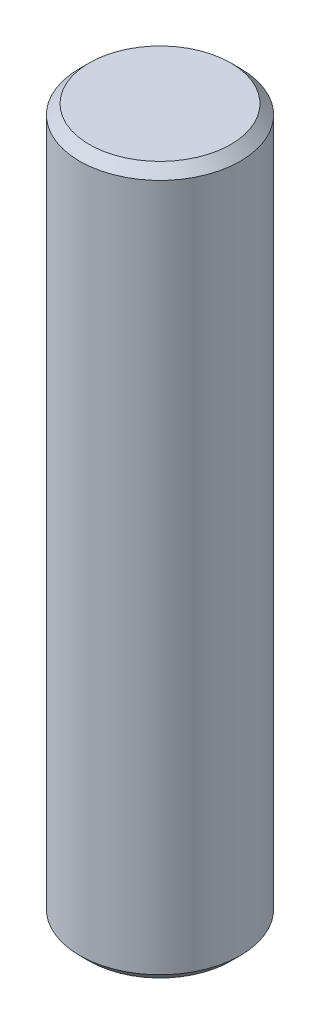
ISO-10303-21;
HEADER;
FILE_DESCRIPTION(('STEP AP214'),'2;1');
FILE_NAME('part.step','',(''),(''),'','','');
FILE_SCHEMA(('AUTOMOTIVE_DESIGN { 1 0 10303 214 1 1 1 1 }'));
ENDSEC;
DATA;
#1=APPLICATION_CONTEXT('core data for automotive mechanical design processes');
#2=APPLICATION_PROTOCOL_DEFINITION('international standard','automotive_design',2000,#1);
#3=PRODUCT_CONTEXT('',#1,'mechanical');
#4=PRODUCT('Part','Part','',(#3));
#5=PRODUCT_RELATED_PRODUCT_CATEGORY('part','',(#4));
#6=PRODUCT_DEFINITION_FORMATION('','',#4);
#7=PRODUCT_DEFINITION_CONTEXT('part definition',#1,'design');
#8=PRODUCT_DEFINITION('design','',#6,#7);
#9=PRODUCT_DEFINITION_SHAPE('','',#8);
#10=(LENGTH_UNIT() NAMED_UNIT(*) SI_UNIT(.MILLI.,.METRE.));
#11=(NAMED_UNIT(*) PLANE_ANGLE_UNIT() SI_UNIT($,.RADIAN.));
#12=(NAMED_UNIT(*) SI_UNIT($,.STERADIAN.) SOLID_ANGLE_UNIT());
#13=UNCERTAINTY_MEASURE_WITH_UNIT(LENGTH_MEASURE(1.E-05),#10,'distance_accuracy_value','');
#14=(GEOMETRIC_REPRESENTATION_CONTEXT(3) GLOBAL_UNCERTAINTY_ASSIGNED_CONTEXT((#13)) GLOBAL_UNIT_ASSIGNED_CONTEXT((#10,
#11,#12)) REPRESENTATION_CONTEXT('',''));
#15=CARTESIAN_POINT('',(0.,0.,0.));
#16=DIRECTION('',(0.,0.,1.));
#17=DIRECTION('',(1.,0.,0.));
#18=AXIS2_PLACEMENT_3D('',#15,#16,#17);
#19=CARTESIAN_POINT('',(0.,-220.,0.));
#20=DIRECTION('',(0.,1.,0.));
#21=DIRECTION('',(0.,0.,1.));
#22=AXIS2_PLACEMENT_3D('',#19,#20,#21);
#23=CYLINDRICAL_SURFACE('',#22,25.);
#24=CARTESIAN_POINT('',(0.,-217.,0.));
#25=DIRECTION('',(0.,1.,0.));
#26=DIRECTION('',(0.,0.,1.));
#27=AXIS2_PLACEMENT_3D('',#24,#25,#26);
#28=CIRCLE('',#27,25.);
#29=CARTESIAN_POINT('',(0.,-217.,25.));
#30=VERTEX_POINT('',#29);
#31=EDGE_CURVE('E51',#30,#30,#28,.T.);
#32=ORIENTED_EDGE('',*,*,#31,.T.);
#33=EDGE_LOOP('',(#32));
#34=FACE_BOUND('',#33,.T.);
#35=CARTESIAN_POINT('',(0.,-2.99999999999998,0.));
#36=DIRECTION('',(0.,1.,0.));
#37=DIRECTION('',(0.,0.,1.));
#38=AXIS2_PLACEMENT_3D('',#35,#36,#37);
#39=CIRCLE('',#38,25.);
#40=CARTESIAN_POINT('',(0.,-2.99999999999998,-25.));
#41=VERTEX_POINT('',#40);
#42=EDGE_CURVE('E55',#41,#41,#39,.F.);
#43=ORIENTED_EDGE('',*,*,#42,.T.);
#44=EDGE_LOOP('',(#43));
#45=FACE_BOUND('',#44,.T.);
#46=ADVANCED_FACE('F39',(#34,#45),#23,.T.);
#47=CARTESIAN_POINT('',(0.,-220.,0.));
#48=DIRECTION('',(0.,1.,0.));
#49=DIRECTION('',(0.,0.,1.));
#50=AXIS2_PLACEMENT_3D('',#47,#48,#49);
#51=PLANE('',#50);
#52=CARTESIAN_POINT('',(0.,-220.,0.));
#53=DIRECTION('',(0.,1.,0.));
#54=DIRECTION('',(0.,0.,1.));
#55=AXIS2_PLACEMENT_3D('',#52,#53,#54);
#56=CIRCLE('',#55,22.);
#57=CARTESIAN_POINT('',(0.,-220.,22.));
#58=VERTEX_POINT('',#57);
#59=EDGE_CURVE('E47',#58,#58,#56,.F.);
#60=ORIENTED_EDGE('',*,*,#59,.T.);
#61=EDGE_LOOP('',(#60));
#62=FACE_BOUND('',#61,.T.);
#63=ADVANCED_FACE('F71',(#62),#51,.F.);
#64=CARTESIAN_POINT('',(0.,0.,0.));
#65=DIRECTION('',(0.,1.,0.));
#66=DIRECTION('',(0.,0.,1.));
#67=AXIS2_PLACEMENT_3D('',#64,#65,#66);
#68=PLANE('',#67);
#69=CARTESIAN_POINT('',(0.,0.,0.));
#70=DIRECTION('',(0.,1.,0.));
#71=DIRECTION('',(0.,0.,1.));
#72=AXIS2_PLACEMENT_3D('',#69,#70,#71);
#73=CIRCLE('',#72,22.);
#74=CARTESIAN_POINT('',(0.,0.,-22.));
#75=VERTEX_POINT('',#74);
#76=EDGE_CURVE('E10',#75,#75,#73,.T.);
#77=ORIENTED_EDGE('',*,*,#76,.T.);
#78=EDGE_LOOP('',(#77));
#79=FACE_BOUND('',#78,.T.);
#80=ADVANCED_FACE('F68',(#79),#68,.T.);
#81=CARTESIAN_POINT('',(0.,-217.,0.));
#82=DIRECTION('',(0.,1.,0.));
#83=DIRECTION('',(0.,0.,1.));
#84=AXIS2_PLACEMENT_3D('',#81,#82,#83);
#85=CONICAL_SURFACE('',#84,25.,0.785398163397445);
#86=ORIENTED_EDGE('',*,*,#59,.F.);
#87=EDGE_LOOP('',(#86));
#88=FACE_BOUND('',#87,.T.);
#89=ORIENTED_EDGE('',*,*,#31,.F.);
#90=EDGE_LOOP('',(#89));
#91=FACE_BOUND('',#90,.T.);
#92=ADVANCED_FACE('F64',(#88,#91),#85,.T.);
#93=CARTESIAN_POINT('',(0.,0.,0.));
#94=DIRECTION('',(0.,-1.,0.));
#95=DIRECTION('',(0.,0.,-1.));
#96=AXIS2_PLACEMENT_3D('',#93,#94,#95);
#97=CONICAL_SURFACE('',#96,22.,0.78539816339745);
#98=CARTESIAN_POINT('',(0.,-2.99999999999998,-25.));
#99=CARTESIAN_POINT('',(0.,-2.96874999999997,-24.96875));
#100=CARTESIAN_POINT('',(0.,-2.93749999999998,-24.9375));
#101=CARTESIAN_POINT('',(0.,-2.87499999999998,-24.875));
#102=CARTESIAN_POINT('',(0.,-2.84374999999998,-24.84375));
#103=CARTESIAN_POINT('',(0.,-2.78124999999998,-24.78125));
#104=CARTESIAN_POINT('',(0.,-2.74999999999998,-24.75));
#105=CARTESIAN_POINT('',(0.,-2.68749999999998,-24.6875));
#106=CARTESIAN_POINT('',(0.,-2.65624999999998,-24.65625));
#107=CARTESIAN_POINT('',(0.,-2.59374999999998,-24.59375));
#108=CARTESIAN_POINT('',(0.,-2.56249999999998,-24.5625));
#109=CARTESIAN_POINT('',(0.,-2.49999999999998,-24.5));
#110=CARTESIAN_POINT('',(0.,-2.46874999999998,-24.46875));
#111=CARTESIAN_POINT('',(0.,-2.40624999999998,-24.40625));
#112=CARTESIAN_POINT('',(0.,-2.37499999999998,-24.375));
#113=CARTESIAN_POINT('',(0.,-2.31249999999998,-24.3125));
#114=CARTESIAN_POINT('',(0.,-2.28124999999998,-24.28125));
#115=CARTESIAN_POINT('',(0.,-2.21874999999998,-24.21875));
#116=CARTESIAN_POINT('',(0.,-2.18749999999998,-24.1875));
#117=CARTESIAN_POINT('',(0.,-2.12499999999998,-24.125));
#118=CARTESIAN_POINT('',(0.,-2.09374999999998,-24.09375));
#119=CARTESIAN_POINT('',(0.,-2.03124999999998,-24.03125));
#120=CARTESIAN_POINT('',(0.,-1.99999999999998,-24.));
#121=CARTESIAN_POINT('',(0.,-1.93749999999998,-23.9375));
#122=CARTESIAN_POINT('',(0.,-1.90624999999998,-23.90625));
#123=CARTESIAN_POINT('',(0.,-1.84374999999998,-23.84375));
#124=CARTESIAN_POINT('',(0.,-1.81249999999998,-23.8125));
#125=CARTESIAN_POINT('',(0.,-1.74999999999999,-23.75));
#126=CARTESIAN_POINT('',(0.,-1.71874999999999,-23.71875));
#127=CARTESIAN_POINT('',(0.,-1.65624999999999,-23.65625));
#128=CARTESIAN_POINT('',(0.,-1.62499999999999,-23.625));
#129=CARTESIAN_POINT('',(0.,-1.56249999999999,-23.5625));
#130=CARTESIAN_POINT('',(0.,-1.53124999999999,-23.53125));
#131=CARTESIAN_POINT('',(0.,-1.46874999999999,-23.46875));
#132=CARTESIAN_POINT('',(0.,-1.43749999999999,-23.4375));
#133=CARTESIAN_POINT('',(0.,-1.37499999999999,-23.375));
#134=CARTESIAN_POINT('',(0.,-1.34374999999999,-23.34375));
#135=CARTESIAN_POINT('',(0.,-1.28124999999999,-23.28125));
#136=CARTESIAN_POINT('',(0.,-1.24999999999999,-23.25));
#137=CARTESIAN_POINT('',(0.,-1.18749999999999,-23.1875));
#138=CARTESIAN_POINT('',(0.,-1.15624999999999,-23.15625));
#139=CARTESIAN_POINT('',(0.,-1.09374999999999,-23.09375));
#140=CARTESIAN_POINT('',(0.,-1.06249999999999,-23.0625));
#141=CARTESIAN_POINT('',(0.,-0.999999999999992,-23.));
#142=CARTESIAN_POINT('',(0.,-0.968749999999992,-22.96875));
#143=CARTESIAN_POINT('',(0.,-0.906249999999993,-22.90625));
#144=CARTESIAN_POINT('',(0.,-0.874999999999993,-22.875));
#145=CARTESIAN_POINT('',(0.,-0.812499999999994,-22.8125));
#146=CARTESIAN_POINT('',(0.,-0.781249999999993,-22.78125));
#147=CARTESIAN_POINT('',(0.,-0.718749999999993,-22.71875));
#148=CARTESIAN_POINT('',(0.,-0.687499999999994,-22.6875));
#149=CARTESIAN_POINT('',(0.,-0.624999999999995,-22.625));
#150=CARTESIAN_POINT('',(0.,-0.593749999999995,-22.59375));
#151=CARTESIAN_POINT('',(0.,-0.531249999999995,-22.53125));
#152=CARTESIAN_POINT('',(0.,-0.499999999999996,-22.5));
#153=CARTESIAN_POINT('',(0.,-0.437499999999996,-22.4375));
#154=CARTESIAN_POINT('',(0.,-0.406249999999996,-22.40625));
#155=CARTESIAN_POINT('',(0.,-0.343749999999997,-22.34375));
#156=CARTESIAN_POINT('',(0.,-0.312499999999998,-22.3125));
#157=CARTESIAN_POINT('',(0.,-0.249999999999998,-22.25));
#158=CARTESIAN_POINT('',(0.,-0.218749999999998,-22.21875));
#159=CARTESIAN_POINT('',(0.,-0.156249999999998,-22.15625));
#160=CARTESIAN_POINT('',(0.,-0.124999999999999,-22.125));
#161=CARTESIAN_POINT('',(0.,-0.0624999999999997,-22.0625));
#162=CARTESIAN_POINT('',(0.,-0.0312500000000002,-22.03125));
#163=CARTESIAN_POINT('',(0.,0.,-22.));
#164=B_SPLINE_CURVE_WITH_KNOTS('',3,(#98,#99,#100,#101,#102,#103,#104,#105,#106,#107,#108,#109,
#110,#111,#112,#113,#114,#115,#116,#117,#118,#119,#120,#121,#122,#123,#124,#125,#126,#127,#128,
#129,#130,#131,#132,#133,#134,#135,#136,#137,#138,#139,#140,#141,#142,#143,#144,#145,#146,#147,
#148,#149,#150,#151,#152,#153,#154,#155,#156,#157,#158,#159,#160,#161,#162,#163),.UNSPECIFIED.,
.F.,.F.,(4,2,2,2,2,2,2,2,2,2,2,2,2,2,2,2,2,2,2,2,2,2,2,2,2,2,2,2,2,2,2,2,4),(0.,
0.132582521472475,0.265165042944952,0.397747564417429,0.530330085889906,0.662912607362383,
0.795495128834858,0.928077650307335,1.06066017177981,1.19324269325229,1.32582521472477,
1.45840773619724,1.59099025766972,1.7235727791422,1.85615530061467,1.98873782208715,
2.12132034355963,2.2539028650321,2.38648538650458,2.51906790797706,2.65165042944953,
2.78423295092201,2.91681547239449,3.04939799386697,3.18198051533944,3.31456303681192,
3.44714555828439,3.57972807975687,3.71231060122935,3.84489312270183,3.9774756441743,
4.11005816564678,4.24264068711926),.UNSPECIFIED.);
#165=EDGE_CURVE('BSEAM42',#41,#75,#164,.T.);
#166=ORIENTED_EDGE('',*,*,#42,.F.);
#167=ORIENTED_EDGE('',*,*,#76,.F.);
#168=ORIENTED_EDGE('',*,*,#165,.T.);
#169=ORIENTED_EDGE('',*,*,#165,.F.);
#170=EDGE_LOOP('',(#166,#168,#167,#169));
#171=FACE_BOUND('',#170,.T.);
#172=ADVANCED_FACE('F42',(#171),#97,.T.);
#173=CLOSED_SHELL('',(#46,#63,#80,#92,#172));
#174=MANIFOLD_SOLID_BREP('B2',#173);
#175=ADVANCED_BREP_SHAPE_REPRESENTATION('',(#18,#174),#14);
#176=SHAPE_DEFINITION_REPRESENTATION(#9,#175);
ENDSEC;
END-ISO-10303-21;
